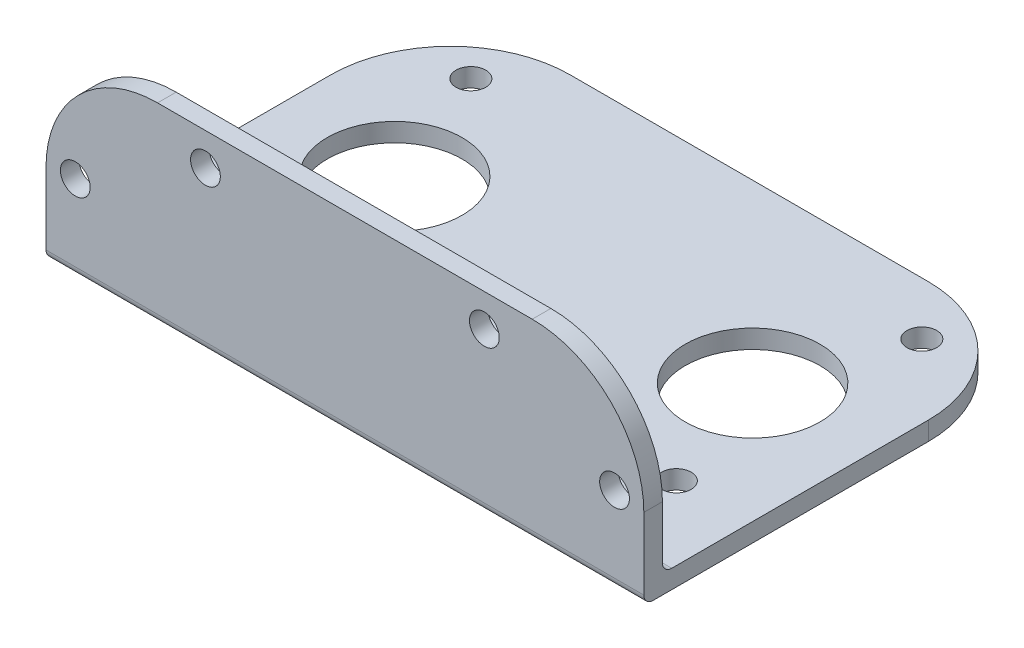
ISO-10303-21;
HEADER;
FILE_DESCRIPTION(('STEP AP214'),'2;1');
FILE_NAME('part.step','',(''),(''),'','','');
FILE_SCHEMA(('AUTOMOTIVE_DESIGN { 1 0 10303 214 1 1 1 1 }'));
ENDSEC;
DATA;
#1=APPLICATION_CONTEXT('core data for automotive mechanical design processes');
#2=APPLICATION_PROTOCOL_DEFINITION('international standard','automotive_design',2000,#1);
#3=PRODUCT_CONTEXT('',#1,'mechanical');
#4=PRODUCT('Part','Part','',(#3));
#5=PRODUCT_RELATED_PRODUCT_CATEGORY('part','',(#4));
#6=PRODUCT_DEFINITION_FORMATION('','',#4);
#7=PRODUCT_DEFINITION_CONTEXT('part definition',#1,'design');
#8=PRODUCT_DEFINITION('design','',#6,#7);
#9=PRODUCT_DEFINITION_SHAPE('','',#8);
#10=(LENGTH_UNIT() NAMED_UNIT(*) SI_UNIT(.MILLI.,.METRE.));
#11=(NAMED_UNIT(*) PLANE_ANGLE_UNIT() SI_UNIT($,.RADIAN.));
#12=(NAMED_UNIT(*) SI_UNIT($,.STERADIAN.) SOLID_ANGLE_UNIT());
#13=UNCERTAINTY_MEASURE_WITH_UNIT(LENGTH_MEASURE(1.E-05),#10,'distance_accuracy_value','');
#14=(GEOMETRIC_REPRESENTATION_CONTEXT(3) GLOBAL_UNCERTAINTY_ASSIGNED_CONTEXT((#13)) GLOBAL_UNIT_ASSIGNED_CONTEXT((#10,
#11,#12)) REPRESENTATION_CONTEXT('',''));
#15=CARTESIAN_POINT('',(0.,0.,0.));
#16=DIRECTION('',(0.,0.,1.));
#17=DIRECTION('',(1.,0.,0.));
#18=AXIS2_PLACEMENT_3D('',#15,#16,#17);
#19=CARTESIAN_POINT('',(51.4,2.,-30.6));
#20=DIRECTION('',(0.,1.,0.));
#21=DIRECTION('',(0.,0.,1.));
#22=AXIS2_PLACEMENT_3D('',#19,#20,#21);
#23=PLANE('',#22);
#24=DIRECTION('',(0.,0.,1.));
#25=VECTOR('',#24,1.);
#26=CARTESIAN_POINT('',(0.,2.,-30.6));
#27=LINE('',#26,#25);
#28=CARTESIAN_POINT('',(0.,2.,-30.6));
#29=VERTEX_POINT('',#28);
#30=CARTESIAN_POINT('',(0.,2.,-3.));
#31=VERTEX_POINT('',#30);
#32=EDGE_CURVE('E135',#29,#31,#27,.T.);
#33=ORIENTED_EDGE('',*,*,#32,.T.);
#34=DIRECTION('',(-1.,0.,0.));
#35=VECTOR('',#34,1.);
#36=CARTESIAN_POINT('',(51.4,2.,-3.));
#37=LINE('',#36,#35);
#38=CARTESIAN_POINT('',(64.3,2.,-3.));
#39=VERTEX_POINT('',#38);
#40=EDGE_CURVE('E132',#31,#39,#37,.F.);
#41=ORIENTED_EDGE('',*,*,#40,.T.);
#42=DIRECTION('',(0.,0.,-1.));
#43=VECTOR('',#42,1.);
#44=CARTESIAN_POINT('',(64.3,2.,0.));
#45=LINE('',#44,#43);
#46=CARTESIAN_POINT('',(64.3,2.,-30.6));
#47=VERTEX_POINT('',#46);
#48=EDGE_CURVE('E126',#39,#47,#45,.T.);
#49=ORIENTED_EDGE('',*,*,#48,.T.);
#50=CARTESIAN_POINT('',(51.4,2.,-30.6));
#51=DIRECTION('',(0.,1.,0.));
#52=DIRECTION('',(0.,0.,1.));
#53=AXIS2_PLACEMENT_3D('',#50,#51,#52);
#54=CIRCLE('',#53,12.9);
#55=CARTESIAN_POINT('',(51.4,2.,-43.5));
#56=VERTEX_POINT('',#55);
#57=EDGE_CURVE('E130',#47,#56,#54,.T.);
#58=ORIENTED_EDGE('',*,*,#57,.T.);
#59=DIRECTION('',(-1.,0.,0.));
#60=VECTOR('',#59,1.);
#61=CARTESIAN_POINT('',(51.4,2.,-43.5));
#62=LINE('',#61,#60);
#63=CARTESIAN_POINT('',(12.9,2.,-43.5));
#64=VERTEX_POINT('',#63);
#65=EDGE_CURVE('E151',#56,#64,#62,.T.);
#66=ORIENTED_EDGE('',*,*,#65,.T.);
#67=CARTESIAN_POINT('',(12.9,2.,-30.6));
#68=DIRECTION('',(0.,1.,0.));
#69=DIRECTION('',(0.,0.,1.));
#70=AXIS2_PLACEMENT_3D('',#67,#68,#69);
#71=CIRCLE('',#70,12.9);
#72=EDGE_CURVE('E153',#64,#29,#71,.T.);
#73=ORIENTED_EDGE('',*,*,#72,.T.);
#74=EDGE_LOOP('',(#33,#41,#49,#58,#66,#73));
#75=FACE_BOUND('',#74,.T.);
#76=CARTESIAN_POINT('',(56.4023547703491,2.,-37.8));
#77=DIRECTION('',(0.,1.,0.));
#78=DIRECTION('',(0.,0.,-1.));
#79=AXIS2_PLACEMENT_3D('',#76,#77,#78);
#80=CIRCLE('',#79,1.6);
#81=CARTESIAN_POINT('',(56.4023547703491,2.,-39.4));
#82=VERTEX_POINT('',#81);
#83=EDGE_CURVE('E261',#82,#82,#80,.T.);
#84=ORIENTED_EDGE('',*,*,#83,.F.);
#85=EDGE_LOOP('',(#84));
#86=FACE_BOUND('',#85,.T.);
#87=CARTESIAN_POINT('',(56.4023547703491,2.,-11.4));
#88=DIRECTION('',(0.,1.,0.));
#89=DIRECTION('',(0.,0.,-1.));
#90=AXIS2_PLACEMENT_3D('',#87,#88,#89);
#91=CIRCLE('',#90,1.6);
#92=CARTESIAN_POINT('',(56.4023547703491,2.,-13.));
#93=VERTEX_POINT('',#92);
#94=EDGE_CURVE('E273',#93,#93,#91,.T.);
#95=ORIENTED_EDGE('',*,*,#94,.F.);
#96=EDGE_LOOP('',(#95));
#97=FACE_BOUND('',#96,.T.);
#98=CARTESIAN_POINT('',(7.89764522965086,2.,-11.4));
#99=DIRECTION('',(0.,1.,0.));
#100=DIRECTION('',(0.,0.,1.));
#101=AXIS2_PLACEMENT_3D('',#98,#99,#100);
#102=CIRCLE('',#101,1.6);
#103=CARTESIAN_POINT('',(7.89764522965086,2.,-9.8));
#104=VERTEX_POINT('',#103);
#105=EDGE_CURVE('E162',#104,#104,#102,.T.);
#106=ORIENTED_EDGE('',*,*,#105,.F.);
#107=EDGE_LOOP('',(#106));
#108=FACE_BOUND('',#107,.T.);
#109=CARTESIAN_POINT('',(7.89764522965086,2.,-37.8));
#110=DIRECTION('',(0.,1.,0.));
#111=DIRECTION('',(0.,0.,1.));
#112=AXIS2_PLACEMENT_3D('',#109,#110,#111);
#113=CIRCLE('',#112,1.6);
#114=CARTESIAN_POINT('',(7.89764522965086,2.,-36.2));
#115=VERTEX_POINT('',#114);
#116=EDGE_CURVE('E279',#115,#115,#113,.T.);
#117=ORIENTED_EDGE('',*,*,#116,.F.);
#118=EDGE_LOOP('',(#117));
#119=FACE_BOUND('',#118,.T.);
#120=CARTESIAN_POINT('',(12.9,2.,-24.6));
#121=DIRECTION('',(0.,1.,0.));
#122=DIRECTION('',(0.,0.,1.));
#123=AXIS2_PLACEMENT_3D('',#120,#121,#122);
#124=CIRCLE('',#123,7.25);
#125=CARTESIAN_POINT('',(12.9,2.,-17.35));
#126=VERTEX_POINT('',#125);
#127=EDGE_CURVE('E267',#126,#126,#124,.T.);
#128=ORIENTED_EDGE('',*,*,#127,.F.);
#129=EDGE_LOOP('',(#128));
#130=FACE_BOUND('',#129,.T.);
#131=CARTESIAN_POINT('',(51.4,2.,-24.6));
#132=DIRECTION('',(0.,1.,0.));
#133=DIRECTION('',(0.,0.,-1.));
#134=AXIS2_PLACEMENT_3D('',#131,#132,#133);
#135=CIRCLE('',#134,7.25);
#136=CARTESIAN_POINT('',(51.4,2.,-31.85));
#137=VERTEX_POINT('',#136);
#138=EDGE_CURVE('E255',#137,#137,#135,.T.);
#139=ORIENTED_EDGE('',*,*,#138,.F.);
#140=EDGE_LOOP('',(#139));
#141=FACE_BOUND('',#140,.T.);
#142=ADVANCED_FACE('F39',(#75,#86,#97,#108,#119,#130,#141),#23,.T.);
#143=CARTESIAN_POINT('',(51.4,0.,-30.6));
#144=DIRECTION('',(0.,1.,0.));
#145=DIRECTION('',(0.,0.,1.));
#146=AXIS2_PLACEMENT_3D('',#143,#144,#145);
#147=PLANE('',#146);
#148=DIRECTION('',(0.,0.,-1.));
#149=VECTOR('',#148,1.);
#150=CARTESIAN_POINT('',(64.3,0.,0.));
#151=LINE('',#150,#149);
#152=CARTESIAN_POINT('',(64.3,0.,-1.));
#153=VERTEX_POINT('',#152);
#154=CARTESIAN_POINT('',(64.3,0.,-30.6));
#155=VERTEX_POINT('',#154);
#156=EDGE_CURVE('E142',#153,#155,#151,.T.);
#157=ORIENTED_EDGE('',*,*,#156,.F.);
#158=DIRECTION('',(1.,0.,0.));
#159=VECTOR('',#158,1.);
#160=CARTESIAN_POINT('',(51.4,0.,-1.));
#161=LINE('',#160,#159);
#162=CARTESIAN_POINT('',(0.,0.,-1.));
#163=VERTEX_POINT('',#162);
#164=EDGE_CURVE('E205',#153,#163,#161,.F.);
#165=ORIENTED_EDGE('',*,*,#164,.T.);
#166=DIRECTION('',(0.,0.,1.));
#167=VECTOR('',#166,1.);
#168=CARTESIAN_POINT('',(0.,0.,-30.6));
#169=LINE('',#168,#167);
#170=CARTESIAN_POINT('',(0.,0.,-30.6));
#171=VERTEX_POINT('',#170);
#172=EDGE_CURVE('E159',#171,#163,#169,.T.);
#173=ORIENTED_EDGE('',*,*,#172,.F.);
#174=CARTESIAN_POINT('',(12.9,0.,-30.6));
#175=DIRECTION('',(0.,1.,0.));
#176=DIRECTION('',(0.,0.,1.));
#177=AXIS2_PLACEMENT_3D('',#174,#175,#176);
#178=CIRCLE('',#177,12.9);
#179=CARTESIAN_POINT('',(12.9,0.,-43.5));
#180=VERTEX_POINT('',#179);
#181=EDGE_CURVE('E168',#180,#171,#178,.T.);
#182=ORIENTED_EDGE('',*,*,#181,.F.);
#183=DIRECTION('',(-1.,0.,0.));
#184=VECTOR('',#183,1.);
#185=CARTESIAN_POINT('',(51.4,0.,-43.5));
#186=LINE('',#185,#184);
#187=CARTESIAN_POINT('',(51.4,0.,-43.5));
#188=VERTEX_POINT('',#187);
#189=EDGE_CURVE('E166',#188,#180,#186,.T.);
#190=ORIENTED_EDGE('',*,*,#189,.F.);
#191=CARTESIAN_POINT('',(51.4,0.,-30.6));
#192=DIRECTION('',(0.,1.,0.));
#193=DIRECTION('',(0.,0.,1.));
#194=AXIS2_PLACEMENT_3D('',#191,#192,#193);
#195=CIRCLE('',#194,12.9);
#196=EDGE_CURVE('E164',#155,#188,#195,.T.);
#197=ORIENTED_EDGE('',*,*,#196,.F.);
#198=EDGE_LOOP('',(#157,#165,#173,#182,#190,#197));
#199=FACE_BOUND('',#198,.T.);
#200=CARTESIAN_POINT('',(7.89764522965086,0.,-11.4));
#201=DIRECTION('',(0.,1.,0.));
#202=DIRECTION('',(0.,0.,1.));
#203=AXIS2_PLACEMENT_3D('',#200,#201,#202);
#204=CIRCLE('',#203,1.6);
#205=CARTESIAN_POINT('',(7.89764522965086,0.,-9.8));
#206=VERTEX_POINT('',#205);
#207=EDGE_CURVE('E282',#206,#206,#204,.T.);
#208=ORIENTED_EDGE('',*,*,#207,.T.);
#209=EDGE_LOOP('',(#208));
#210=FACE_BOUND('',#209,.T.);
#211=CARTESIAN_POINT('',(7.89764522965086,0.,-37.8));
#212=DIRECTION('',(0.,1.,0.));
#213=DIRECTION('',(0.,0.,1.));
#214=AXIS2_PLACEMENT_3D('',#211,#212,#213);
#215=CIRCLE('',#214,1.6);
#216=CARTESIAN_POINT('',(7.89764522965086,0.,-36.2));
#217=VERTEX_POINT('',#216);
#218=EDGE_CURVE('E276',#217,#217,#215,.T.);
#219=ORIENTED_EDGE('',*,*,#218,.T.);
#220=EDGE_LOOP('',(#219));
#221=FACE_BOUND('',#220,.T.);
#222=CARTESIAN_POINT('',(56.4023547703491,0.,-11.4));
#223=DIRECTION('',(0.,1.,0.));
#224=DIRECTION('',(0.,0.,-1.));
#225=AXIS2_PLACEMENT_3D('',#222,#223,#224);
#226=CIRCLE('',#225,1.6);
#227=CARTESIAN_POINT('',(56.4023547703491,0.,-13.));
#228=VERTEX_POINT('',#227);
#229=EDGE_CURVE('E270',#228,#228,#226,.T.);
#230=ORIENTED_EDGE('',*,*,#229,.T.);
#231=EDGE_LOOP('',(#230));
#232=FACE_BOUND('',#231,.T.);
#233=CARTESIAN_POINT('',(12.9,0.,-24.6));
#234=DIRECTION('',(0.,1.,0.));
#235=DIRECTION('',(0.,0.,1.));
#236=AXIS2_PLACEMENT_3D('',#233,#234,#235);
#237=CIRCLE('',#236,7.25);
#238=CARTESIAN_POINT('',(12.9,0.,-17.35));
#239=VERTEX_POINT('',#238);
#240=EDGE_CURVE('E264',#239,#239,#237,.T.);
#241=ORIENTED_EDGE('',*,*,#240,.T.);
#242=EDGE_LOOP('',(#241));
#243=FACE_BOUND('',#242,.T.);
#244=CARTESIAN_POINT('',(56.4023547703491,0.,-37.8));
#245=DIRECTION('',(0.,1.,0.));
#246=DIRECTION('',(0.,0.,-1.));
#247=AXIS2_PLACEMENT_3D('',#244,#245,#246);
#248=CIRCLE('',#247,1.6);
#249=CARTESIAN_POINT('',(56.4023547703491,0.,-39.4));
#250=VERTEX_POINT('',#249);
#251=EDGE_CURVE('E258',#250,#250,#248,.T.);
#252=ORIENTED_EDGE('',*,*,#251,.T.);
#253=EDGE_LOOP('',(#252));
#254=FACE_BOUND('',#253,.T.);
#255=CARTESIAN_POINT('',(51.4,0.,-24.6));
#256=DIRECTION('',(0.,1.,0.));
#257=DIRECTION('',(0.,0.,-1.));
#258=AXIS2_PLACEMENT_3D('',#255,#256,#257);
#259=CIRCLE('',#258,7.25);
#260=CARTESIAN_POINT('',(51.4,0.,-31.85));
#261=VERTEX_POINT('',#260);
#262=EDGE_CURVE('E239',#261,#261,#259,.T.);
#263=ORIENTED_EDGE('',*,*,#262,.T.);
#264=EDGE_LOOP('',(#263));
#265=FACE_BOUND('',#264,.T.);
#266=ADVANCED_FACE('F313',(#199,#210,#221,#232,#243,#254,#265),#147,.F.);
#267=CARTESIAN_POINT('',(0.,2.,-30.6));
#268=DIRECTION('',(1.,0.,0.));
#269=DIRECTION('',(0.,0.,-1.));
#270=AXIS2_PLACEMENT_3D('',#267,#268,#269);
#271=PLANE('',#270);
#272=ORIENTED_EDGE('',*,*,#172,.T.);
#273=CARTESIAN_POINT('',(0.,1.,-1.));
#274=DIRECTION('',(1.,0.,0.));
#275=DIRECTION('',(0.,0.,-1.));
#276=AXIS2_PLACEMENT_3D('',#273,#274,#275);
#277=CIRCLE('',#276,1.);
#278=CARTESIAN_POINT('',(0.,1.,0.));
#279=VERTEX_POINT('',#278);
#280=EDGE_CURVE('E207',#163,#279,#277,.F.);
#281=ORIENTED_EDGE('',*,*,#280,.T.);
#282=DIRECTION('',(0.,-1.,0.));
#283=VECTOR('',#282,1.);
#284=CARTESIAN_POINT('',(0.,2.,0.));
#285=LINE('',#284,#283);
#286=CARTESIAN_POINT('',(0.,8.7,0.));
#287=VERTEX_POINT('',#286);
#288=EDGE_CURVE('E177',#287,#279,#285,.T.);
#289=ORIENTED_EDGE('',*,*,#288,.F.);
#290=DIRECTION('',(0.,0.,1.));
#291=VECTOR('',#290,1.);
#292=CARTESIAN_POINT('',(0.,8.7,-2.));
#293=LINE('',#292,#291);
#294=CARTESIAN_POINT('',(0.,8.7,-2.));
#295=VERTEX_POINT('',#294);
#296=EDGE_CURVE('E189',#287,#295,#293,.F.);
#297=ORIENTED_EDGE('',*,*,#296,.T.);
#298=DIRECTION('',(0.,1.,0.));
#299=VECTOR('',#298,1.);
#300=CARTESIAN_POINT('',(0.,0.,-2.));
#301=LINE('',#300,#299);
#302=CARTESIAN_POINT('',(0.,3.,-2.));
#303=VERTEX_POINT('',#302);
#304=EDGE_CURVE('E215',#303,#295,#301,.T.);
#305=ORIENTED_EDGE('',*,*,#304,.F.);
#306=CARTESIAN_POINT('',(0.,3.,-3.));
#307=DIRECTION('',(1.,0.,0.));
#308=DIRECTION('',(0.,0.,-1.));
#309=AXIS2_PLACEMENT_3D('',#306,#307,#308);
#310=CIRCLE('',#309,1.);
#311=EDGE_CURVE('E47',#303,#31,#310,.T.);
#312=ORIENTED_EDGE('',*,*,#311,.T.);
#313=ORIENTED_EDGE('',*,*,#32,.F.);
#314=DIRECTION('',(0.,-1.,0.));
#315=VECTOR('',#314,1.);
#316=CARTESIAN_POINT('',(0.,2.,-30.6));
#317=LINE('',#316,#315);
#318=EDGE_CURVE('E158',#29,#171,#317,.T.);
#319=ORIENTED_EDGE('',*,*,#318,.T.);
#320=EDGE_LOOP('',(#272,#281,#289,#297,#305,#312,#313,#319));
#321=FACE_BOUND('',#320,.T.);
#322=ADVANCED_FACE('F217',(#321),#271,.F.);
#323=CARTESIAN_POINT('',(0.,2.,0.));
#324=DIRECTION('',(0.,0.,-1.));
#325=DIRECTION('',(-1.,0.,0.));
#326=AXIS2_PLACEMENT_3D('',#323,#324,#325);
#327=PLANE('',#326);
#328=ORIENTED_EDGE('',*,*,#288,.T.);
#329=DIRECTION('',(1.,0.,0.));
#330=VECTOR('',#329,1.);
#331=CARTESIAN_POINT('',(0.,1.,0.));
#332=LINE('',#331,#330);
#333=CARTESIAN_POINT('',(64.3,1.,0.));
#334=VERTEX_POINT('',#333);
#335=EDGE_CURVE('E200',#279,#334,#332,.T.);
#336=ORIENTED_EDGE('',*,*,#335,.T.);
#337=DIRECTION('',(0.,-1.,0.));
#338=VECTOR('',#337,1.);
#339=CARTESIAN_POINT('',(64.3,2.,0.));
#340=LINE('',#339,#338);
#341=CARTESIAN_POINT('',(64.3,8.70000000000001,0.));
#342=VERTEX_POINT('',#341);
#343=EDGE_CURVE('E145',#342,#334,#340,.T.);
#344=ORIENTED_EDGE('',*,*,#343,.F.);
#345=CARTESIAN_POINT('',(52.3,8.70000000000001,0.));
#346=DIRECTION('',(0.,0.,-1.));
#347=DIRECTION('',(-1.,0.,0.));
#348=AXIS2_PLACEMENT_3D('',#345,#346,#347);
#349=CIRCLE('',#348,12.);
#350=CARTESIAN_POINT('',(52.3,20.7,0.));
#351=VERTEX_POINT('',#350);
#352=EDGE_CURVE('E185',#342,#351,#349,.F.);
#353=ORIENTED_EDGE('',*,*,#352,.T.);
#354=DIRECTION('',(-1.,0.,0.));
#355=VECTOR('',#354,1.);
#356=CARTESIAN_POINT('',(0.,20.7,0.));
#357=LINE('',#356,#355);
#358=CARTESIAN_POINT('',(12.,20.7,0.));
#359=VERTEX_POINT('',#358);
#360=EDGE_CURVE('E240',#351,#359,#357,.T.);
#361=ORIENTED_EDGE('',*,*,#360,.T.);
#362=CARTESIAN_POINT('',(12.,8.7,0.));
#363=DIRECTION('',(0.,0.,-1.));
#364=DIRECTION('',(-1.,0.,0.));
#365=AXIS2_PLACEMENT_3D('',#362,#363,#364);
#366=CIRCLE('',#365,12.);
#367=EDGE_CURVE('E187',#359,#287,#366,.F.);
#368=ORIENTED_EDGE('',*,*,#367,.T.);
#369=EDGE_LOOP('',(#328,#336,#344,#353,#361,#368));
#370=FACE_BOUND('',#369,.T.);
#371=CARTESIAN_POINT('',(17.15,17.2,0.));
#372=DIRECTION('',(0.,0.,1.));
#373=DIRECTION('',(1.,0.,0.));
#374=AXIS2_PLACEMENT_3D('',#371,#372,#373);
#375=CIRCLE('',#374,1.6);
#376=CARTESIAN_POINT('',(18.75,17.2,0.));
#377=VERTEX_POINT('',#376);
#378=EDGE_CURVE('E243',#377,#377,#375,.T.);
#379=ORIENTED_EDGE('',*,*,#378,.F.);
#380=EDGE_LOOP('',(#379));
#381=FACE_BOUND('',#380,.T.);
#382=CARTESIAN_POINT('',(3.15,9.2,0.));
#383=DIRECTION('',(0.,0.,1.));
#384=DIRECTION('',(1.,0.,0.));
#385=AXIS2_PLACEMENT_3D('',#382,#383,#384);
#386=CIRCLE('',#385,1.6);
#387=CARTESIAN_POINT('',(4.75,9.2,0.));
#388=VERTEX_POINT('',#387);
#389=EDGE_CURVE('E246',#388,#388,#386,.T.);
#390=ORIENTED_EDGE('',*,*,#389,.F.);
#391=EDGE_LOOP('',(#390));
#392=FACE_BOUND('',#391,.T.);
#393=CARTESIAN_POINT('',(47.15,17.2,0.));
#394=DIRECTION('',(0.,0.,1.));
#395=DIRECTION('',(1.,0.,0.));
#396=AXIS2_PLACEMENT_3D('',#393,#394,#395);
#397=CIRCLE('',#396,1.6);
#398=CARTESIAN_POINT('',(48.75,17.2,0.));
#399=VERTEX_POINT('',#398);
#400=EDGE_CURVE('E249',#399,#399,#397,.F.);
#401=ORIENTED_EDGE('',*,*,#400,.T.);
#402=EDGE_LOOP('',(#401));
#403=FACE_BOUND('',#402,.T.);
#404=CARTESIAN_POINT('',(61.15,9.2,0.));
#405=DIRECTION('',(0.,0.,1.));
#406=DIRECTION('',(1.,0.,0.));
#407=AXIS2_PLACEMENT_3D('',#404,#405,#406);
#408=CIRCLE('',#407,1.6);
#409=CARTESIAN_POINT('',(62.75,9.2,0.));
#410=VERTEX_POINT('',#409);
#411=EDGE_CURVE('E252',#410,#410,#408,.F.);
#412=ORIENTED_EDGE('',*,*,#411,.T.);
#413=EDGE_LOOP('',(#412));
#414=FACE_BOUND('',#413,.T.);
#415=ADVANCED_FACE('F299',(#370,#381,#392,#403,#414),#327,.F.);
#416=CARTESIAN_POINT('',(64.3,2.,0.));
#417=DIRECTION('',(-1.,0.,0.));
#418=DIRECTION('',(0.,0.,1.));
#419=AXIS2_PLACEMENT_3D('',#416,#417,#418);
#420=PLANE('',#419);
#421=ORIENTED_EDGE('',*,*,#343,.T.);
#422=CARTESIAN_POINT('',(64.3,1.,-1.));
#423=DIRECTION('',(-1.,0.,0.));
#424=DIRECTION('',(0.,0.,1.));
#425=AXIS2_PLACEMENT_3D('',#422,#423,#424);
#426=CIRCLE('',#425,1.);
#427=EDGE_CURVE('E203',#334,#153,#426,.F.);
#428=ORIENTED_EDGE('',*,*,#427,.T.);
#429=ORIENTED_EDGE('',*,*,#156,.T.);
#430=DIRECTION('',(0.,-1.,0.));
#431=VECTOR('',#430,1.);
#432=CARTESIAN_POINT('',(64.3,2.,-30.6));
#433=LINE('',#432,#431);
#434=EDGE_CURVE('E138',#47,#155,#433,.T.);
#435=ORIENTED_EDGE('',*,*,#434,.F.);
#436=ORIENTED_EDGE('',*,*,#48,.F.);
#437=CARTESIAN_POINT('',(64.3,3.,-3.));
#438=DIRECTION('',(-1.,0.,0.));
#439=DIRECTION('',(0.,0.,1.));
#440=AXIS2_PLACEMENT_3D('',#437,#438,#439);
#441=CIRCLE('',#440,1.);
#442=CARTESIAN_POINT('',(64.3,3.,-2.));
#443=VERTEX_POINT('',#442);
#444=EDGE_CURVE('E11',#39,#443,#441,.T.);
#445=ORIENTED_EDGE('',*,*,#444,.T.);
#446=DIRECTION('',(0.,1.,0.));
#447=VECTOR('',#446,1.);
#448=CARTESIAN_POINT('',(64.3,0.,-2.));
#449=LINE('',#448,#447);
#450=CARTESIAN_POINT('',(64.3,8.70000000000001,-2.));
#451=VERTEX_POINT('',#450);
#452=EDGE_CURVE('E216',#443,#451,#449,.T.);
#453=ORIENTED_EDGE('',*,*,#452,.T.);
#454=DIRECTION('',(0.,0.,1.));
#455=VECTOR('',#454,1.);
#456=CARTESIAN_POINT('',(64.3,8.70000000000001,0.));
#457=LINE('',#456,#455);
#458=EDGE_CURVE('E197',#451,#342,#457,.T.);
#459=ORIENTED_EDGE('',*,*,#458,.T.);
#460=EDGE_LOOP('',(#421,#428,#429,#435,#436,#445,#453,#459));
#461=FACE_BOUND('',#460,.T.);
#462=ADVANCED_FACE('F140',(#461),#420,.F.);
#463=CARTESIAN_POINT('',(51.4,2.,-30.6));
#464=DIRECTION('',(0.,-1.,0.));
#465=DIRECTION('',(0.,0.,-1.));
#466=AXIS2_PLACEMENT_3D('',#463,#464,#465);
#467=CYLINDRICAL_SURFACE('',#466,12.9);
#468=ORIENTED_EDGE('',*,*,#196,.T.);
#469=DIRECTION('',(0.,-1.,0.));
#470=VECTOR('',#469,1.);
#471=CARTESIAN_POINT('',(51.4,2.,-43.5));
#472=LINE('',#471,#470);
#473=EDGE_CURVE('E146',#56,#188,#472,.T.);
#474=ORIENTED_EDGE('',*,*,#473,.F.);
#475=ORIENTED_EDGE('',*,*,#57,.F.);
#476=ORIENTED_EDGE('',*,*,#434,.T.);
#477=EDGE_LOOP('',(#468,#474,#475,#476));
#478=FACE_BOUND('',#477,.T.);
#479=ADVANCED_FACE('F148',(#478),#467,.T.);
#480=CARTESIAN_POINT('',(51.4,2.,-43.5));
#481=DIRECTION('',(0.,0.,1.));
#482=DIRECTION('',(1.,0.,0.));
#483=AXIS2_PLACEMENT_3D('',#480,#481,#482);
#484=PLANE('',#483);
#485=ORIENTED_EDGE('',*,*,#189,.T.);
#486=DIRECTION('',(0.,-1.,0.));
#487=VECTOR('',#486,1.);
#488=CARTESIAN_POINT('',(12.9,2.,-43.5));
#489=LINE('',#488,#487);
#490=EDGE_CURVE('E172',#64,#180,#489,.T.);
#491=ORIENTED_EDGE('',*,*,#490,.F.);
#492=ORIENTED_EDGE('',*,*,#65,.F.);
#493=ORIENTED_EDGE('',*,*,#473,.T.);
#494=EDGE_LOOP('',(#485,#491,#492,#493));
#495=FACE_BOUND('',#494,.T.);
#496=ADVANCED_FACE('F318',(#495),#484,.F.);
#497=CARTESIAN_POINT('',(12.9,2.,-30.6));
#498=DIRECTION('',(0.,-1.,0.));
#499=DIRECTION('',(0.,0.,-1.));
#500=AXIS2_PLACEMENT_3D('',#497,#498,#499);
#501=CYLINDRICAL_SURFACE('',#500,12.9);
#502=ORIENTED_EDGE('',*,*,#181,.T.);
#503=ORIENTED_EDGE('',*,*,#318,.F.);
#504=ORIENTED_EDGE('',*,*,#72,.F.);
#505=ORIENTED_EDGE('',*,*,#490,.T.);
#506=EDGE_LOOP('',(#502,#503,#504,#505));
#507=FACE_BOUND('',#506,.T.);
#508=ADVANCED_FACE('F321',(#507),#501,.T.);
#509=CARTESIAN_POINT('',(7.89764522965086,2.,-11.4));
#510=DIRECTION('',(0.,-1.,0.));
#511=DIRECTION('',(0.,0.,-1.));
#512=AXIS2_PLACEMENT_3D('',#509,#510,#511);
#513=CYLINDRICAL_SURFACE('',#512,1.6);
#514=ORIENTED_EDGE('',*,*,#105,.T.);
#515=EDGE_LOOP('',(#514));
#516=FACE_BOUND('',#515,.T.);
#517=ORIENTED_EDGE('',*,*,#207,.F.);
#518=EDGE_LOOP('',(#517));
#519=FACE_BOUND('',#518,.T.);
#520=ADVANCED_FACE('F323',(#516,#519),#513,.F.);
#521=CARTESIAN_POINT('',(7.89764522965086,2.,-37.8));
#522=DIRECTION('',(0.,-1.,0.));
#523=DIRECTION('',(0.,0.,-1.));
#524=AXIS2_PLACEMENT_3D('',#521,#522,#523);
#525=CYLINDRICAL_SURFACE('',#524,1.6);
#526=ORIENTED_EDGE('',*,*,#116,.T.);
#527=EDGE_LOOP('',(#526));
#528=FACE_BOUND('',#527,.T.);
#529=ORIENTED_EDGE('',*,*,#218,.F.);
#530=EDGE_LOOP('',(#529));
#531=FACE_BOUND('',#530,.T.);
#532=ADVANCED_FACE('F329',(#528,#531),#525,.F.);
#533=CARTESIAN_POINT('',(56.4023547703491,2.,-11.4));
#534=DIRECTION('',(0.,-1.,0.));
#535=DIRECTION('',(0.,0.,-1.));
#536=AXIS2_PLACEMENT_3D('',#533,#534,#535);
#537=CYLINDRICAL_SURFACE('',#536,1.6);
#538=ORIENTED_EDGE('',*,*,#94,.T.);
#539=EDGE_LOOP('',(#538));
#540=FACE_BOUND('',#539,.T.);
#541=ORIENTED_EDGE('',*,*,#229,.F.);
#542=EDGE_LOOP('',(#541));
#543=FACE_BOUND('',#542,.T.);
#544=ADVANCED_FACE('F342',(#540,#543),#537,.F.);
#545=CARTESIAN_POINT('',(12.9,2.,-24.6));
#546=DIRECTION('',(0.,-1.,0.));
#547=DIRECTION('',(0.,0.,-1.));
#548=AXIS2_PLACEMENT_3D('',#545,#546,#547);
#549=CYLINDRICAL_SURFACE('',#548,7.25);
#550=ORIENTED_EDGE('',*,*,#127,.T.);
#551=EDGE_LOOP('',(#550));
#552=FACE_BOUND('',#551,.T.);
#553=ORIENTED_EDGE('',*,*,#240,.F.);
#554=EDGE_LOOP('',(#553));
#555=FACE_BOUND('',#554,.T.);
#556=ADVANCED_FACE('F346',(#552,#555),#549,.F.);
#557=CARTESIAN_POINT('',(56.4023547703491,2.,-37.8));
#558=DIRECTION('',(0.,-1.,0.));
#559=DIRECTION('',(0.,0.,-1.));
#560=AXIS2_PLACEMENT_3D('',#557,#558,#559);
#561=CYLINDRICAL_SURFACE('',#560,1.6);
#562=ORIENTED_EDGE('',*,*,#83,.T.);
#563=EDGE_LOOP('',(#562));
#564=FACE_BOUND('',#563,.T.);
#565=ORIENTED_EDGE('',*,*,#251,.F.);
#566=EDGE_LOOP('',(#565));
#567=FACE_BOUND('',#566,.T.);
#568=ADVANCED_FACE('F350',(#564,#567),#561,.F.);
#569=CARTESIAN_POINT('',(51.4,2.,-24.6));
#570=DIRECTION('',(0.,-1.,0.));
#571=DIRECTION('',(0.,0.,-1.));
#572=AXIS2_PLACEMENT_3D('',#569,#570,#571);
#573=CYLINDRICAL_SURFACE('',#572,7.25);
#574=ORIENTED_EDGE('',*,*,#138,.T.);
#575=EDGE_LOOP('',(#574));
#576=FACE_BOUND('',#575,.T.);
#577=ORIENTED_EDGE('',*,*,#262,.F.);
#578=EDGE_LOOP('',(#577));
#579=FACE_BOUND('',#578,.T.);
#580=ADVANCED_FACE('F354',(#576,#579),#573,.F.);
#581=CARTESIAN_POINT('',(0.,20.7,-2.));
#582=DIRECTION('',(0.,1.,0.));
#583=DIRECTION('',(-1.,0.,0.));
#584=AXIS2_PLACEMENT_3D('',#581,#582,#583);
#585=PLANE('',#584);
#586=DIRECTION('',(-1.,0.,0.));
#587=VECTOR('',#586,1.);
#588=CARTESIAN_POINT('',(0.,20.7,-2.));
#589=LINE('',#588,#587);
#590=CARTESIAN_POINT('',(52.3,20.7,-2.));
#591=VERTEX_POINT('',#590);
#592=CARTESIAN_POINT('',(12.,20.7,-2.));
#593=VERTEX_POINT('',#592);
#594=EDGE_CURVE('E222',#591,#593,#589,.T.);
#595=ORIENTED_EDGE('',*,*,#594,.T.);
#596=DIRECTION('',(0.,0.,1.));
#597=VECTOR('',#596,1.);
#598=CARTESIAN_POINT('',(12.,20.7,0.));
#599=LINE('',#598,#597);
#600=EDGE_CURVE('E182',#593,#359,#599,.T.);
#601=ORIENTED_EDGE('',*,*,#600,.T.);
#602=ORIENTED_EDGE('',*,*,#360,.F.);
#603=DIRECTION('',(0.,0.,1.));
#604=VECTOR('',#603,1.);
#605=CARTESIAN_POINT('',(52.3,20.7,-2.));
#606=LINE('',#605,#604);
#607=EDGE_CURVE('E180',#351,#591,#606,.F.);
#608=ORIENTED_EDGE('',*,*,#607,.T.);
#609=EDGE_LOOP('',(#595,#601,#602,#608));
#610=FACE_BOUND('',#609,.T.);
#611=ADVANCED_FACE('F302',(#610),#585,.T.);
#612=CARTESIAN_POINT('',(47.15,17.2,-2.));
#613=DIRECTION('',(0.,0.,1.));
#614=DIRECTION('',(1.,0.,0.));
#615=AXIS2_PLACEMENT_3D('',#612,#613,#614);
#616=CYLINDRICAL_SURFACE('',#615,1.6);
#617=CARTESIAN_POINT('',(47.15,17.2,-2.));
#618=DIRECTION('',(0.,0.,1.));
#619=DIRECTION('',(1.,0.,0.));
#620=AXIS2_PLACEMENT_3D('',#617,#618,#619);
#621=CIRCLE('',#620,1.6);
#622=CARTESIAN_POINT('',(48.75,17.2,-2.));
#623=VERTEX_POINT('',#622);
#624=EDGE_CURVE('E233',#623,#623,#621,.F.);
#625=ORIENTED_EDGE('',*,*,#624,.T.);
#626=EDGE_LOOP('',(#625));
#627=FACE_BOUND('',#626,.T.);
#628=ORIENTED_EDGE('',*,*,#400,.F.);
#629=EDGE_LOOP('',(#628));
#630=FACE_BOUND('',#629,.T.);
#631=ADVANCED_FACE('F361',(#627,#630),#616,.F.);
#632=CARTESIAN_POINT('',(3.15,9.2,-2.));
#633=DIRECTION('',(0.,0.,1.));
#634=DIRECTION('',(1.,0.,0.));
#635=AXIS2_PLACEMENT_3D('',#632,#633,#634);
#636=CYLINDRICAL_SURFACE('',#635,1.6);
#637=CARTESIAN_POINT('',(3.15,9.2,-2.));
#638=DIRECTION('',(0.,0.,1.));
#639=DIRECTION('',(1.,0.,0.));
#640=AXIS2_PLACEMENT_3D('',#637,#638,#639);
#641=CIRCLE('',#640,1.6);
#642=CARTESIAN_POINT('',(4.75,9.2,-2.));
#643=VERTEX_POINT('',#642);
#644=EDGE_CURVE('E225',#643,#643,#641,.T.);
#645=ORIENTED_EDGE('',*,*,#644,.F.);
#646=EDGE_LOOP('',(#645));
#647=FACE_BOUND('',#646,.T.);
#648=ORIENTED_EDGE('',*,*,#389,.T.);
#649=EDGE_LOOP('',(#648));
#650=FACE_BOUND('',#649,.T.);
#651=ADVANCED_FACE('F366',(#647,#650),#636,.F.);
#652=CARTESIAN_POINT('',(17.15,17.2,-2.));
#653=DIRECTION('',(0.,0.,1.));
#654=DIRECTION('',(1.,0.,0.));
#655=AXIS2_PLACEMENT_3D('',#652,#653,#654);
#656=CYLINDRICAL_SURFACE('',#655,1.6);
#657=CARTESIAN_POINT('',(17.15,17.2,-2.));
#658=DIRECTION('',(0.,0.,1.));
#659=DIRECTION('',(1.,0.,0.));
#660=AXIS2_PLACEMENT_3D('',#657,#658,#659);
#661=CIRCLE('',#660,1.6);
#662=CARTESIAN_POINT('',(18.75,17.2,-2.));
#663=VERTEX_POINT('',#662);
#664=EDGE_CURVE('E221',#663,#663,#661,.T.);
#665=ORIENTED_EDGE('',*,*,#664,.F.);
#666=EDGE_LOOP('',(#665));
#667=FACE_BOUND('',#666,.T.);
#668=ORIENTED_EDGE('',*,*,#378,.T.);
#669=EDGE_LOOP('',(#668));
#670=FACE_BOUND('',#669,.T.);
#671=ADVANCED_FACE('F362',(#667,#670),#656,.F.);
#672=CARTESIAN_POINT('',(61.15,9.2,-2.));
#673=DIRECTION('',(0.,0.,1.));
#674=DIRECTION('',(1.,0.,0.));
#675=AXIS2_PLACEMENT_3D('',#672,#673,#674);
#676=CYLINDRICAL_SURFACE('',#675,1.6);
#677=CARTESIAN_POINT('',(61.15,9.2,-2.));
#678=DIRECTION('',(0.,0.,1.));
#679=DIRECTION('',(1.,0.,0.));
#680=AXIS2_PLACEMENT_3D('',#677,#678,#679);
#681=CIRCLE('',#680,1.6);
#682=CARTESIAN_POINT('',(62.75,9.2,-2.));
#683=VERTEX_POINT('',#682);
#684=EDGE_CURVE('E236',#683,#683,#681,.F.);
#685=ORIENTED_EDGE('',*,*,#684,.T.);
#686=EDGE_LOOP('',(#685));
#687=FACE_BOUND('',#686,.T.);
#688=ORIENTED_EDGE('',*,*,#411,.F.);
#689=EDGE_LOOP('',(#688));
#690=FACE_BOUND('',#689,.T.);
#691=ADVANCED_FACE('F365',(#687,#690),#676,.F.);
#692=CARTESIAN_POINT('',(0.,0.,-2.));
#693=DIRECTION('',(0.,0.,1.));
#694=DIRECTION('',(1.,0.,0.));
#695=AXIS2_PLACEMENT_3D('',#692,#693,#694);
#696=PLANE('',#695);
#697=ORIENTED_EDGE('',*,*,#452,.F.);
#698=DIRECTION('',(-1.,0.,0.));
#699=VECTOR('',#698,1.);
#700=CARTESIAN_POINT('',(0.,3.,-2.));
#701=LINE('',#700,#699);
#702=EDGE_CURVE('E209',#443,#303,#701,.T.);
#703=ORIENTED_EDGE('',*,*,#702,.T.);
#704=ORIENTED_EDGE('',*,*,#304,.T.);
#705=CARTESIAN_POINT('',(12.,8.7,-2.));
#706=DIRECTION('',(0.,0.,1.));
#707=DIRECTION('',(1.,0.,0.));
#708=AXIS2_PLACEMENT_3D('',#705,#706,#707);
#709=CIRCLE('',#708,12.);
#710=EDGE_CURVE('E195',#295,#593,#709,.F.);
#711=ORIENTED_EDGE('',*,*,#710,.T.);
#712=ORIENTED_EDGE('',*,*,#594,.F.);
#713=CARTESIAN_POINT('',(52.3,8.70000000000001,-2.));
#714=DIRECTION('',(0.,0.,1.));
#715=DIRECTION('',(1.,0.,0.));
#716=AXIS2_PLACEMENT_3D('',#713,#714,#715);
#717=CIRCLE('',#716,12.);
#718=EDGE_CURVE('E192',#591,#451,#717,.F.);
#719=ORIENTED_EDGE('',*,*,#718,.T.);
#720=EDGE_LOOP('',(#697,#703,#704,#711,#712,#719));
#721=FACE_BOUND('',#720,.T.);
#722=ORIENTED_EDGE('',*,*,#664,.T.);
#723=EDGE_LOOP('',(#722));
#724=FACE_BOUND('',#723,.T.);
#725=ORIENTED_EDGE('',*,*,#644,.T.);
#726=EDGE_LOOP('',(#725));
#727=FACE_BOUND('',#726,.T.);
#728=ORIENTED_EDGE('',*,*,#624,.F.);
#729=EDGE_LOOP('',(#728));
#730=FACE_BOUND('',#729,.T.);
#731=ORIENTED_EDGE('',*,*,#684,.F.);
#732=EDGE_LOOP('',(#731));
#733=FACE_BOUND('',#732,.T.);
#734=ADVANCED_FACE('F213',(#721,#724,#727,#730,#733),#696,.F.);
#735=CARTESIAN_POINT('',(12.,8.7,-2.));
#736=DIRECTION('',(0.,0.,-1.));
#737=DIRECTION('',(-1.,0.,0.));
#738=AXIS2_PLACEMENT_3D('',#735,#736,#737);
#739=CYLINDRICAL_SURFACE('',#738,12.);
#740=ORIENTED_EDGE('',*,*,#710,.F.);
#741=ORIENTED_EDGE('',*,*,#296,.F.);
#742=ORIENTED_EDGE('',*,*,#367,.F.);
#743=ORIENTED_EDGE('',*,*,#600,.F.);
#744=EDGE_LOOP('',(#740,#741,#742,#743));
#745=FACE_BOUND('',#744,.T.);
#746=ADVANCED_FACE('F305',(#745),#739,.T.);
#747=CARTESIAN_POINT('',(52.3,8.70000000000001,0.));
#748=DIRECTION('',(0.,0.,-1.));
#749=DIRECTION('',(-1.,0.,0.));
#750=AXIS2_PLACEMENT_3D('',#747,#748,#749);
#751=CYLINDRICAL_SURFACE('',#750,12.);
#752=ORIENTED_EDGE('',*,*,#718,.F.);
#753=ORIENTED_EDGE('',*,*,#607,.F.);
#754=ORIENTED_EDGE('',*,*,#352,.F.);
#755=ORIENTED_EDGE('',*,*,#458,.F.);
#756=EDGE_LOOP('',(#752,#753,#754,#755));
#757=FACE_BOUND('',#756,.T.);
#758=ADVANCED_FACE('F296',(#757),#751,.T.);
#759=CARTESIAN_POINT('',(0.,1.,-1.));
#760=DIRECTION('',(1.,0.,0.));
#761=DIRECTION('',(0.,0.,-1.));
#762=AXIS2_PLACEMENT_3D('',#759,#760,#761);
#763=CYLINDRICAL_SURFACE('',#762,1.);
#764=ORIENTED_EDGE('',*,*,#280,.F.);
#765=ORIENTED_EDGE('',*,*,#164,.F.);
#766=ORIENTED_EDGE('',*,*,#427,.F.);
#767=ORIENTED_EDGE('',*,*,#335,.F.);
#768=EDGE_LOOP('',(#764,#765,#766,#767));
#769=FACE_BOUND('',#768,.T.);
#770=ADVANCED_FACE('F311',(#769),#763,.T.);
#771=CARTESIAN_POINT('',(0.,3.,-3.));
#772=DIRECTION('',(-1.,0.,0.));
#773=DIRECTION('',(0.,0.,1.));
#774=AXIS2_PLACEMENT_3D('',#771,#772,#773);
#775=CYLINDRICAL_SURFACE('',#774,1.);
#776=ORIENTED_EDGE('',*,*,#444,.F.);
#777=ORIENTED_EDGE('',*,*,#40,.F.);
#778=ORIENTED_EDGE('',*,*,#311,.F.);
#779=ORIENTED_EDGE('',*,*,#702,.F.);
#780=EDGE_LOOP('',(#776,#777,#778,#779));
#781=FACE_BOUND('',#780,.T.);
#782=ADVANCED_FACE('F41',(#781),#775,.F.);
#783=CLOSED_SHELL('',(#142,#266,#322,#415,#462,#479,#496,#508,#520,#532,#544,#556,#568,#580,
#611,#631,#651,#671,#691,#734,#746,#758,#770,#782));
#784=MANIFOLD_SOLID_BREP('B2',#783);
#785=ADVANCED_BREP_SHAPE_REPRESENTATION('',(#18,#784),#14);
#786=SHAPE_DEFINITION_REPRESENTATION(#9,#785);
ENDSEC;
END-ISO-10303-21;
